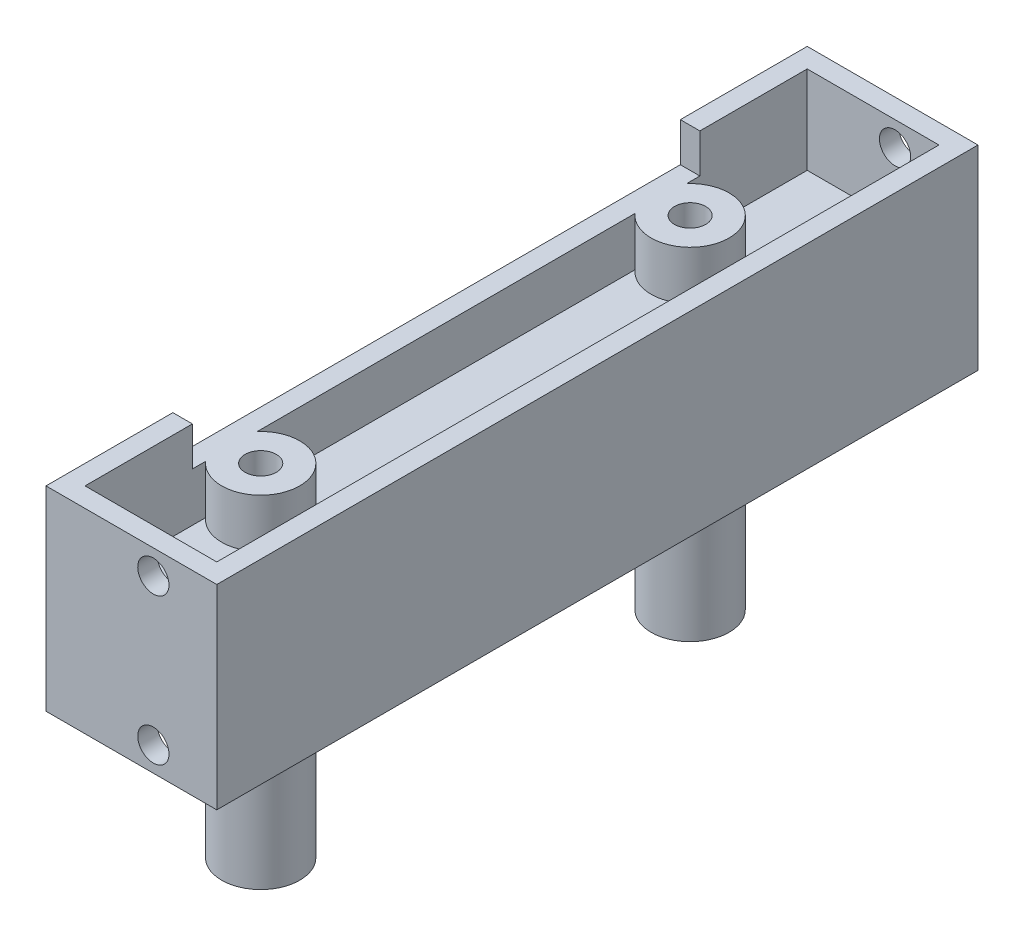
ISO-10303-21;
HEADER;
FILE_DESCRIPTION(('STEP AP214'),'2;1');
FILE_NAME('part.step','',(''),(''),'','','');
FILE_SCHEMA(('AUTOMOTIVE_DESIGN { 1 0 10303 214 1 1 1 1 }'));
ENDSEC;
DATA;
#1=APPLICATION_CONTEXT('core data for automotive mechanical design processes');
#2=APPLICATION_PROTOCOL_DEFINITION('international standard','automotive_design',2000,#1);
#3=PRODUCT_CONTEXT('',#1,'mechanical');
#4=PRODUCT('Part','Part','',(#3));
#5=PRODUCT_RELATED_PRODUCT_CATEGORY('part','',(#4));
#6=PRODUCT_DEFINITION_FORMATION('','',#4);
#7=PRODUCT_DEFINITION_CONTEXT('part definition',#1,'design');
#8=PRODUCT_DEFINITION('design','',#6,#7);
#9=PRODUCT_DEFINITION_SHAPE('','',#8);
#10=(LENGTH_UNIT() NAMED_UNIT(*) SI_UNIT(.MILLI.,.METRE.));
#11=(NAMED_UNIT(*) PLANE_ANGLE_UNIT() SI_UNIT($,.RADIAN.));
#12=(NAMED_UNIT(*) SI_UNIT($,.STERADIAN.) SOLID_ANGLE_UNIT());
#13=UNCERTAINTY_MEASURE_WITH_UNIT(LENGTH_MEASURE(1.E-05),#10,'distance_accuracy_value','');
#14=(GEOMETRIC_REPRESENTATION_CONTEXT(3) GLOBAL_UNCERTAINTY_ASSIGNED_CONTEXT((#13)) GLOBAL_UNIT_ASSIGNED_CONTEXT((#10,
#11,#12)) REPRESENTATION_CONTEXT('',''));
#15=CARTESIAN_POINT('',(0.,0.,0.));
#16=DIRECTION('',(0.,0.,1.));
#17=DIRECTION('',(1.,0.,0.));
#18=AXIS2_PLACEMENT_3D('',#15,#16,#17);
#19=CARTESIAN_POINT('',(-30.,11.,-37.));
#20=DIRECTION('',(0.,-1.,0.));
#21=DIRECTION('',(0.,0.,-1.));
#22=AXIS2_PLACEMENT_3D('',#19,#20,#21);
#23=PLANE('',#22);
#24=DIRECTION('',(-1.,0.,0.));
#25=VECTOR('',#24,1.);
#26=CARTESIAN_POINT('',(10.0573726740956,11.,-26.));
#27=LINE('',#26,#25);
#28=CARTESIAN_POINT('',(16.5,11.,-26.));
#29=VERTEX_POINT('',#28);
#30=CARTESIAN_POINT('',(14.5,11.,-26.));
#31=VERTEX_POINT('',#30);
#32=EDGE_CURVE('E450',#29,#31,#27,.T.);
#33=ORIENTED_EDGE('',*,*,#32,.F.);
#34=DIRECTION('',(0.,0.,-1.));
#35=VECTOR('',#34,1.);
#36=CARTESIAN_POINT('',(16.5,11.,-37.));
#37=LINE('',#36,#35);
#38=CARTESIAN_POINT('',(16.5,11.,-37.));
#39=VERTEX_POINT('',#38);
#40=EDGE_CURVE('E415',#29,#39,#37,.T.);
#41=ORIENTED_EDGE('',*,*,#40,.T.);
#42=DIRECTION('',(-1.,0.,0.));
#43=VECTOR('',#42,1.);
#44=CARTESIAN_POINT('',(-30.,11.,-37.));
#45=LINE('',#44,#43);
#46=CARTESIAN_POINT('',(30.,11.,-37.));
#47=VERTEX_POINT('',#46);
#48=EDGE_CURVE('E315',#47,#39,#45,.T.);
#49=ORIENTED_EDGE('',*,*,#48,.F.);
#50=DIRECTION('',(0.,0.,1.));
#51=VECTOR('',#50,1.);
#52=CARTESIAN_POINT('',(30.,11.,39.));
#53=LINE('',#52,#51);
#54=CARTESIAN_POINT('',(30.,11.,37.));
#55=VERTEX_POINT('',#54);
#56=EDGE_CURVE('E421',#47,#55,#53,.T.);
#57=ORIENTED_EDGE('',*,*,#56,.T.);
#58=DIRECTION('',(-1.,0.,0.));
#59=VECTOR('',#58,1.);
#60=CARTESIAN_POINT('',(-30.,11.,37.));
#61=LINE('',#60,#59);
#62=CARTESIAN_POINT('',(16.5,11.,37.));
#63=VERTEX_POINT('',#62);
#64=EDGE_CURVE('E302',#55,#63,#61,.T.);
#65=ORIENTED_EDGE('',*,*,#64,.T.);
#66=CARTESIAN_POINT('',(16.5,11.,26.));
#67=VERTEX_POINT('',#66);
#68=EDGE_CURVE('E391',#63,#67,#37,.T.);
#69=ORIENTED_EDGE('',*,*,#68,.T.);
#70=DIRECTION('',(1.,0.,0.));
#71=VECTOR('',#70,1.);
#72=CARTESIAN_POINT('',(10.0573726740956,11.,26.));
#73=LINE('',#72,#71);
#74=CARTESIAN_POINT('',(14.5,11.,26.));
#75=VERTEX_POINT('',#74);
#76=EDGE_CURVE('E219',#75,#67,#73,.T.);
#77=ORIENTED_EDGE('',*,*,#76,.F.);
#78=DIRECTION('',(0.,0.,-1.));
#79=VECTOR('',#78,1.);
#80=CARTESIAN_POINT('',(14.5,11.,-37.));
#81=LINE('',#80,#79);
#82=CARTESIAN_POINT('',(14.5,11.,39.));
#83=VERTEX_POINT('',#82);
#84=EDGE_CURVE('E361',#83,#75,#81,.T.);
#85=ORIENTED_EDGE('',*,*,#84,.F.);
#86=DIRECTION('',(-1.,0.,0.));
#87=VECTOR('',#86,1.);
#88=CARTESIAN_POINT('',(-30.,11.,39.));
#89=LINE('',#88,#87);
#90=CARTESIAN_POINT('',(32.,11.,39.));
#91=VERTEX_POINT('',#90);
#92=EDGE_CURVE('E299',#91,#83,#89,.T.);
#93=ORIENTED_EDGE('',*,*,#92,.F.);
#94=DIRECTION('',(0.,0.,1.));
#95=VECTOR('',#94,1.);
#96=CARTESIAN_POINT('',(32.,11.,39.));
#97=LINE('',#96,#95);
#98=CARTESIAN_POINT('',(32.,11.,-39.));
#99=VERTEX_POINT('',#98);
#100=EDGE_CURVE('E406',#99,#91,#97,.T.);
#101=ORIENTED_EDGE('',*,*,#100,.F.);
#102=DIRECTION('',(-1.,0.,0.));
#103=VECTOR('',#102,1.);
#104=CARTESIAN_POINT('',(-30.,11.,-39.));
#105=LINE('',#104,#103);
#106=CARTESIAN_POINT('',(14.5,11.,-39.));
#107=VERTEX_POINT('',#106);
#108=EDGE_CURVE('E312',#99,#107,#105,.T.);
#109=ORIENTED_EDGE('',*,*,#108,.T.);
#110=EDGE_CURVE('E366',#31,#107,#81,.T.);
#111=ORIENTED_EDGE('',*,*,#110,.F.);
#112=EDGE_LOOP('',(#33,#41,#49,#57,#65,#69,#77,#85,#93,#101,#109,#111));
#113=FACE_BOUND('',#112,.T.);
#114=ADVANCED_FACE('F41',(#113),#23,.F.);
#115=CARTESIAN_POINT('',(16.5,0.,0.));
#116=DIRECTION('',(-1.,0.,0.));
#117=DIRECTION('',(0.,0.,1.));
#118=AXIS2_PLACEMENT_3D('',#115,#116,#117);
#119=PLANE('',#118);
#120=DIRECTION('',(0.,0.,-1.));
#121=VECTOR('',#120,1.);
#122=CARTESIAN_POINT('',(16.5,7.,0.));
#123=LINE('',#122,#121);
#124=CARTESIAN_POINT('',(16.5,7.,19.3542486889354));
#125=VERTEX_POINT('',#124);
#126=CARTESIAN_POINT('',(16.5,7.,-19.3542486889354));
#127=VERTEX_POINT('',#126);
#128=EDGE_CURVE('E232',#125,#127,#123,.T.);
#129=ORIENTED_EDGE('',*,*,#128,.F.);
#130=DIRECTION('',(0.,-1.,0.));
#131=VECTOR('',#130,1.);
#132=CARTESIAN_POINT('',(16.5,7.,19.3542486889354));
#133=LINE('',#132,#131);
#134=CARTESIAN_POINT('',(16.5,2.,19.3542486889354));
#135=VERTEX_POINT('',#134);
#136=EDGE_CURVE('E382',#125,#135,#133,.T.);
#137=ORIENTED_EDGE('',*,*,#136,.T.);
#138=DIRECTION('',(0.,0.,1.));
#139=VECTOR('',#138,1.);
#140=CARTESIAN_POINT('',(16.5,2.,-37.));
#141=LINE('',#140,#139);
#142=CARTESIAN_POINT('',(16.5,2.,-19.3542486889354));
#143=VERTEX_POINT('',#142);
#144=EDGE_CURVE('E418',#143,#135,#141,.T.);
#145=ORIENTED_EDGE('',*,*,#144,.F.);
#146=DIRECTION('',(0.,-1.,0.));
#147=VECTOR('',#146,1.);
#148=CARTESIAN_POINT('',(16.5,7.,-19.3542486889354));
#149=LINE('',#148,#147);
#150=EDGE_CURVE('E388',#143,#127,#149,.F.);
#151=ORIENTED_EDGE('',*,*,#150,.T.);
#152=EDGE_LOOP('',(#129,#137,#145,#151));
#153=FACE_BOUND('',#152,.T.);
#154=ADVANCED_FACE('F491',(#153),#119,.F.);
#155=CARTESIAN_POINT('',(16.5,7.,26.));
#156=VERTEX_POINT('',#155);
#157=CARTESIAN_POINT('',(16.5,7.,24.6457513110646));
#158=VERTEX_POINT('',#157);
#159=EDGE_CURVE('E47',#156,#158,#123,.T.);
#160=ORIENTED_EDGE('',*,*,#159,.F.);
#161=DIRECTION('',(0.,1.,0.));
#162=VECTOR('',#161,1.);
#163=CARTESIAN_POINT('',(16.5,0.,26.));
#164=LINE('',#163,#162);
#165=EDGE_CURVE('E11',#156,#67,#164,.T.);
#166=ORIENTED_EDGE('',*,*,#165,.T.);
#167=ORIENTED_EDGE('',*,*,#68,.F.);
#168=DIRECTION('',(0.,1.,0.));
#169=VECTOR('',#168,1.);
#170=CARTESIAN_POINT('',(16.5,2.,37.));
#171=LINE('',#170,#169);
#172=CARTESIAN_POINT('',(16.5,2.,37.));
#173=VERTEX_POINT('',#172);
#174=EDGE_CURVE('E411',#173,#63,#171,.T.);
#175=ORIENTED_EDGE('',*,*,#174,.F.);
#176=CARTESIAN_POINT('',(16.5,2.,24.6457513110646));
#177=VERTEX_POINT('',#176);
#178=EDGE_CURVE('E419',#177,#173,#141,.T.);
#179=ORIENTED_EDGE('',*,*,#178,.F.);
#180=DIRECTION('',(0.,-1.,0.));
#181=VECTOR('',#180,1.);
#182=CARTESIAN_POINT('',(16.5,7.,24.6457513110646));
#183=LINE('',#182,#181);
#184=EDGE_CURVE('E231',#177,#158,#183,.F.);
#185=ORIENTED_EDGE('',*,*,#184,.T.);
#186=EDGE_LOOP('',(#160,#166,#167,#175,#179,#185));
#187=FACE_BOUND('',#186,.T.);
#188=ADVANCED_FACE('F233',(#187),#119,.F.);
#189=CARTESIAN_POINT('',(0.,0.,37.));
#190=DIRECTION('',(0.,0.,-1.));
#191=DIRECTION('',(-1.,0.,0.));
#192=AXIS2_PLACEMENT_3D('',#189,#190,#191);
#193=PLANE('',#192);
#194=CARTESIAN_POINT('',(25.5,-6.5,37.));
#195=DIRECTION('',(0.,0.,-1.));
#196=DIRECTION('',(-1.,0.,0.));
#197=AXIS2_PLACEMENT_3D('',#194,#195,#196);
#198=CIRCLE('',#197,1.6);
#199=CARTESIAN_POINT('',(23.9,-6.5,37.));
#200=VERTEX_POINT('',#199);
#201=EDGE_CURVE('E276',#200,#200,#198,.T.);
#202=ORIENTED_EDGE('',*,*,#201,.F.);
#203=EDGE_LOOP('',(#202));
#204=FACE_BOUND('',#203,.T.);
#205=DIRECTION('',(1.,0.,0.));
#206=VECTOR('',#205,1.);
#207=CARTESIAN_POINT('',(-30.,-9.,37.));
#208=LINE('',#207,#206);
#209=CARTESIAN_POINT('',(16.5,-9.,37.));
#210=VERTEX_POINT('',#209);
#211=CARTESIAN_POINT('',(30.,-9.,37.));
#212=VERTEX_POINT('',#211);
#213=EDGE_CURVE('E65',#210,#212,#208,.T.);
#214=ORIENTED_EDGE('',*,*,#213,.F.);
#215=DIRECTION('',(0.,1.,0.));
#216=VECTOR('',#215,1.);
#217=CARTESIAN_POINT('',(16.5,-9.,37.));
#218=LINE('',#217,#216);
#219=CARTESIAN_POINT('',(16.5,-2.,37.));
#220=VERTEX_POINT('',#219);
#221=EDGE_CURVE('E398',#210,#220,#218,.T.);
#222=ORIENTED_EDGE('',*,*,#221,.T.);
#223=DIRECTION('',(1.,0.,0.));
#224=VECTOR('',#223,1.);
#225=CARTESIAN_POINT('',(30.,-2.,37.));
#226=LINE('',#225,#224);
#227=CARTESIAN_POINT('',(30.,-2.,37.));
#228=VERTEX_POINT('',#227);
#229=EDGE_CURVE('E266',#220,#228,#226,.T.);
#230=ORIENTED_EDGE('',*,*,#229,.T.);
#231=DIRECTION('',(0.,1.,0.));
#232=VECTOR('',#231,1.);
#233=CARTESIAN_POINT('',(30.,-9.,37.));
#234=LINE('',#233,#232);
#235=EDGE_CURVE('E310',#212,#228,#234,.T.);
#236=ORIENTED_EDGE('',*,*,#235,.F.);
#237=EDGE_LOOP('',(#214,#222,#230,#236));
#238=FACE_BOUND('',#237,.T.);
#239=ADVANCED_FACE('F529',(#204,#238),#193,.T.);
#240=CARTESIAN_POINT('',(25.5,8.5,37.));
#241=DIRECTION('',(0.,0.,-1.));
#242=DIRECTION('',(-1.,0.,0.));
#243=AXIS2_PLACEMENT_3D('',#240,#241,#242);
#244=CIRCLE('',#243,1.6);
#245=CARTESIAN_POINT('',(23.9,8.5,37.));
#246=VERTEX_POINT('',#245);
#247=EDGE_CURVE('E282',#246,#246,#244,.T.);
#248=ORIENTED_EDGE('',*,*,#247,.F.);
#249=EDGE_LOOP('',(#248));
#250=FACE_BOUND('',#249,.T.);
#251=DIRECTION('',(1.,0.,0.));
#252=VECTOR('',#251,1.);
#253=CARTESIAN_POINT('',(0.,2.,37.));
#254=LINE('',#253,#252);
#255=CARTESIAN_POINT('',(30.,2.,37.));
#256=VERTEX_POINT('',#255);
#257=EDGE_CURVE('E293',#173,#256,#254,.T.);
#258=ORIENTED_EDGE('',*,*,#257,.F.);
#259=ORIENTED_EDGE('',*,*,#174,.T.);
#260=ORIENTED_EDGE('',*,*,#64,.F.);
#261=EDGE_CURVE('E296',#256,#55,#234,.T.);
#262=ORIENTED_EDGE('',*,*,#261,.F.);
#263=EDGE_LOOP('',(#258,#259,#260,#262));
#264=FACE_BOUND('',#263,.T.);
#265=ADVANCED_FACE('F480',(#250,#264),#193,.T.);
#266=CARTESIAN_POINT('',(0.,0.,-37.));
#267=DIRECTION('',(0.,0.,1.));
#268=DIRECTION('',(-1.,0.,0.));
#269=AXIS2_PLACEMENT_3D('',#266,#267,#268);
#270=PLANE('',#269);
#271=CARTESIAN_POINT('',(25.5,-6.5,-37.));
#272=DIRECTION('',(0.,0.,1.));
#273=DIRECTION('',(1.,0.,0.));
#274=AXIS2_PLACEMENT_3D('',#271,#272,#273);
#275=CIRCLE('',#274,1.6);
#276=CARTESIAN_POINT('',(27.1,-6.5,-37.));
#277=VERTEX_POINT('',#276);
#278=EDGE_CURVE('E279',#277,#277,#275,.T.);
#279=ORIENTED_EDGE('',*,*,#278,.F.);
#280=EDGE_LOOP('',(#279));
#281=FACE_BOUND('',#280,.T.);
#282=DIRECTION('',(-1.,0.,0.));
#283=VECTOR('',#282,1.);
#284=CARTESIAN_POINT('',(-30.,-2.,-37.));
#285=LINE('',#284,#283);
#286=CARTESIAN_POINT('',(30.,-2.,-37.));
#287=VERTEX_POINT('',#286);
#288=CARTESIAN_POINT('',(16.5,-2.,-37.));
#289=VERTEX_POINT('',#288);
#290=EDGE_CURVE('E260',#287,#289,#285,.T.);
#291=ORIENTED_EDGE('',*,*,#290,.T.);
#292=DIRECTION('',(0.,-1.,0.));
#293=VECTOR('',#292,1.);
#294=CARTESIAN_POINT('',(16.5,-2.,-37.));
#295=LINE('',#294,#293);
#296=CARTESIAN_POINT('',(16.5,-9.,-37.));
#297=VERTEX_POINT('',#296);
#298=EDGE_CURVE('E57',#289,#297,#295,.T.);
#299=ORIENTED_EDGE('',*,*,#298,.T.);
#300=DIRECTION('',(1.,0.,0.));
#301=VECTOR('',#300,1.);
#302=CARTESIAN_POINT('',(-30.,-9.,-37.));
#303=LINE('',#302,#301);
#304=CARTESIAN_POINT('',(30.,-9.,-37.));
#305=VERTEX_POINT('',#304);
#306=EDGE_CURVE('E324',#297,#305,#303,.T.);
#307=ORIENTED_EDGE('',*,*,#306,.T.);
#308=DIRECTION('',(0.,1.,0.));
#309=VECTOR('',#308,1.);
#310=CARTESIAN_POINT('',(30.,-9.,-37.));
#311=LINE('',#310,#309);
#312=EDGE_CURVE('E325',#305,#287,#311,.T.);
#313=ORIENTED_EDGE('',*,*,#312,.T.);
#314=EDGE_LOOP('',(#291,#299,#307,#313));
#315=FACE_BOUND('',#314,.T.);
#316=ADVANCED_FACE('F508',(#281,#315),#270,.T.);
#317=CARTESIAN_POINT('',(25.5,8.5,-37.));
#318=DIRECTION('',(0.,0.,1.));
#319=DIRECTION('',(1.,0.,0.));
#320=AXIS2_PLACEMENT_3D('',#317,#318,#319);
#321=CIRCLE('',#320,1.6);
#322=CARTESIAN_POINT('',(27.1,8.5,-37.));
#323=VERTEX_POINT('',#322);
#324=EDGE_CURVE('E285',#323,#323,#321,.T.);
#325=ORIENTED_EDGE('',*,*,#324,.F.);
#326=EDGE_LOOP('',(#325));
#327=FACE_BOUND('',#326,.T.);
#328=ORIENTED_EDGE('',*,*,#48,.T.);
#329=DIRECTION('',(0.,-1.,0.));
#330=VECTOR('',#329,1.);
#331=CARTESIAN_POINT('',(16.5,11.,-37.));
#332=LINE('',#331,#330);
#333=CARTESIAN_POINT('',(16.5,2.,-37.));
#334=VERTEX_POINT('',#333);
#335=EDGE_CURVE('E396',#39,#334,#332,.T.);
#336=ORIENTED_EDGE('',*,*,#335,.T.);
#337=DIRECTION('',(-1.,0.,0.));
#338=VECTOR('',#337,1.);
#339=CARTESIAN_POINT('',(0.,2.,-37.));
#340=LINE('',#339,#338);
#341=CARTESIAN_POINT('',(30.,2.,-37.));
#342=VERTEX_POINT('',#341);
#343=EDGE_CURVE('E305',#342,#334,#340,.T.);
#344=ORIENTED_EDGE('',*,*,#343,.F.);
#345=EDGE_CURVE('E317',#342,#47,#311,.T.);
#346=ORIENTED_EDGE('',*,*,#345,.T.);
#347=EDGE_LOOP('',(#328,#336,#344,#346));
#348=FACE_BOUND('',#347,.T.);
#349=ADVANCED_FACE('F506',(#327,#348),#270,.T.);
#350=CARTESIAN_POINT('',(0.,0.,0.));
#351=DIRECTION('',(0.,-1.,0.));
#352=DIRECTION('',(0.,0.,-1.));
#353=AXIS2_PLACEMENT_3D('',#350,#351,#352);
#354=PLANE('',#353);
#355=DIRECTION('',(1.,0.,0.));
#356=VECTOR('',#355,1.);
#357=CARTESIAN_POINT('',(-30.,0.,35.));
#358=LINE('',#357,#356);
#359=CARTESIAN_POINT('',(30.,0.,35.));
#360=VERTEX_POINT('',#359);
#361=CARTESIAN_POINT('',(16.5,0.,35.));
#362=VERTEX_POINT('',#361);
#363=EDGE_CURVE('E263',#360,#362,#358,.F.);
#364=ORIENTED_EDGE('',*,*,#363,.T.);
#365=DIRECTION('',(0.,0.,-1.));
#366=VECTOR('',#365,1.);
#367=CARTESIAN_POINT('',(16.5,0.,35.));
#368=LINE('',#367,#366);
#369=CARTESIAN_POINT('',(16.5,0.,24.6457513110646));
#370=VERTEX_POINT('',#369);
#371=EDGE_CURVE('E401',#362,#370,#368,.T.);
#372=ORIENTED_EDGE('',*,*,#371,.T.);
#373=CARTESIAN_POINT('',(19.5,0.,22.));
#374=DIRECTION('',(0.,-1.,0.));
#375=DIRECTION('',(0.,0.,-1.));
#376=AXIS2_PLACEMENT_3D('',#373,#374,#375);
#377=CIRCLE('',#376,4.);
#378=CARTESIAN_POINT('',(16.5,0.,19.3542486889354));
#379=VERTEX_POINT('',#378);
#380=EDGE_CURVE('E271',#370,#379,#377,.F.);
#381=ORIENTED_EDGE('',*,*,#380,.T.);
#382=CARTESIAN_POINT('',(16.5,0.,-19.3542486889354));
#383=VERTEX_POINT('',#382);
#384=EDGE_CURVE('E403',#379,#383,#368,.T.);
#385=ORIENTED_EDGE('',*,*,#384,.T.);
#386=CARTESIAN_POINT('',(19.5,0.,-22.));
#387=DIRECTION('',(0.,-1.,0.));
#388=DIRECTION('',(0.,0.,-1.));
#389=AXIS2_PLACEMENT_3D('',#386,#387,#388);
#390=CIRCLE('',#389,4.);
#391=CARTESIAN_POINT('',(16.5,0.,-24.6457513110646));
#392=VERTEX_POINT('',#391);
#393=EDGE_CURVE('E268',#383,#392,#390,.F.);
#394=ORIENTED_EDGE('',*,*,#393,.T.);
#395=CARTESIAN_POINT('',(16.5,0.,-35.));
#396=VERTEX_POINT('',#395);
#397=EDGE_CURVE('E408',#392,#396,#368,.T.);
#398=ORIENTED_EDGE('',*,*,#397,.T.);
#399=DIRECTION('',(-1.,0.,0.));
#400=VECTOR('',#399,1.);
#401=CARTESIAN_POINT('',(30.,0.,-35.));
#402=LINE('',#401,#400);
#403=CARTESIAN_POINT('',(30.,0.,-35.));
#404=VERTEX_POINT('',#403);
#405=EDGE_CURVE('E264',#396,#404,#402,.F.);
#406=ORIENTED_EDGE('',*,*,#405,.T.);
#407=DIRECTION('',(0.,0.,-1.));
#408=VECTOR('',#407,1.);
#409=CARTESIAN_POINT('',(30.,0.,39.));
#410=LINE('',#409,#408);
#411=EDGE_CURVE('E290',#360,#404,#410,.T.);
#412=ORIENTED_EDGE('',*,*,#411,.F.);
#413=EDGE_LOOP('',(#364,#372,#381,#385,#394,#398,#406,#412));
#414=FACE_BOUND('',#413,.T.);
#415=ADVANCED_FACE('F507',(#414),#354,.T.);
#416=CARTESIAN_POINT('',(19.5,7.,22.));
#417=DIRECTION('',(0.,-1.,0.));
#418=DIRECTION('',(0.,0.,-1.));
#419=AXIS2_PLACEMENT_3D('',#416,#417,#418);
#420=CYLINDRICAL_SURFACE('',#419,4.);
#421=CARTESIAN_POINT('',(19.5,-28.,22.));
#422=DIRECTION('',(0.,1.,0.));
#423=DIRECTION('',(0.,0.,1.));
#424=AXIS2_PLACEMENT_3D('',#421,#422,#423);
#425=CIRCLE('',#424,4.);
#426=CARTESIAN_POINT('',(19.5,-28.,26.));
#427=VERTEX_POINT('',#426);
#428=EDGE_CURVE('E354',#427,#427,#425,.T.);
#429=ORIENTED_EDGE('',*,*,#428,.T.);
#430=EDGE_LOOP('',(#429));
#431=FACE_BOUND('',#430,.T.);
#432=DIRECTION('',(0.,-1.,0.));
#433=VECTOR('',#432,1.);
#434=CARTESIAN_POINT('',(16.5,7.,19.3542486889354));
#435=LINE('',#434,#433);
#436=CARTESIAN_POINT('',(16.5,-9.,19.3542486889354));
#437=VERTEX_POINT('',#436);
#438=EDGE_CURVE('E374',#379,#437,#435,.T.);
#439=ORIENTED_EDGE('',*,*,#438,.F.);
#440=ORIENTED_EDGE('',*,*,#380,.F.);
#441=DIRECTION('',(0.,-1.,0.));
#442=VECTOR('',#441,1.);
#443=CARTESIAN_POINT('',(16.5,7.,24.6457513110646));
#444=LINE('',#443,#442);
#445=CARTESIAN_POINT('',(16.5,-9.,24.6457513110646));
#446=VERTEX_POINT('',#445);
#447=EDGE_CURVE('E377',#446,#370,#444,.F.);
#448=ORIENTED_EDGE('',*,*,#447,.F.);
#449=CARTESIAN_POINT('',(19.5,-9.,22.));
#450=DIRECTION('',(0.,-1.,0.));
#451=DIRECTION('',(0.,0.,-1.));
#452=AXIS2_PLACEMENT_3D('',#449,#450,#451);
#453=CIRCLE('',#452,4.);
#454=EDGE_CURVE('E390',#446,#437,#453,.T.);
#455=ORIENTED_EDGE('',*,*,#454,.T.);
#456=EDGE_LOOP('',(#439,#440,#448,#455));
#457=FACE_BOUND('',#456,.T.);
#458=ADVANCED_FACE('F518',(#431,#457),#420,.T.);
#459=CARTESIAN_POINT('',(19.5,7.,-22.));
#460=DIRECTION('',(0.,-1.,0.));
#461=DIRECTION('',(0.,0.,-1.));
#462=AXIS2_PLACEMENT_3D('',#459,#460,#461);
#463=CYLINDRICAL_SURFACE('',#462,4.);
#464=CARTESIAN_POINT('',(19.5,-28.,-22.));
#465=DIRECTION('',(0.,1.,0.));
#466=DIRECTION('',(0.,0.,1.));
#467=AXIS2_PLACEMENT_3D('',#464,#465,#466);
#468=CIRCLE('',#467,4.);
#469=CARTESIAN_POINT('',(19.5,-28.,-18.));
#470=VERTEX_POINT('',#469);
#471=EDGE_CURVE('E345',#470,#470,#468,.T.);
#472=ORIENTED_EDGE('',*,*,#471,.T.);
#473=EDGE_LOOP('',(#472));
#474=FACE_BOUND('',#473,.T.);
#475=DIRECTION('',(0.,-1.,0.));
#476=VECTOR('',#475,1.);
#477=CARTESIAN_POINT('',(16.5,7.,-24.6457513110646));
#478=LINE('',#477,#476);
#479=CARTESIAN_POINT('',(16.5,-9.,-24.6457513110646));
#480=VERTEX_POINT('',#479);
#481=EDGE_CURVE('E239',#392,#480,#478,.T.);
#482=ORIENTED_EDGE('',*,*,#481,.F.);
#483=ORIENTED_EDGE('',*,*,#393,.F.);
#484=DIRECTION('',(0.,-1.,0.));
#485=VECTOR('',#484,1.);
#486=CARTESIAN_POINT('',(16.5,7.,-19.3542486889354));
#487=LINE('',#486,#485);
#488=CARTESIAN_POINT('',(16.5,-9.,-19.3542486889354));
#489=VERTEX_POINT('',#488);
#490=EDGE_CURVE('E244',#489,#383,#487,.F.);
#491=ORIENTED_EDGE('',*,*,#490,.F.);
#492=CARTESIAN_POINT('',(19.5,-9.,-22.));
#493=DIRECTION('',(0.,-1.,0.));
#494=DIRECTION('',(0.,0.,-1.));
#495=AXIS2_PLACEMENT_3D('',#492,#493,#494);
#496=CIRCLE('',#495,4.);
#497=EDGE_CURVE('E393',#489,#480,#496,.T.);
#498=ORIENTED_EDGE('',*,*,#497,.T.);
#499=EDGE_LOOP('',(#482,#483,#491,#498));
#500=FACE_BOUND('',#499,.T.);
#501=ADVANCED_FACE('F589',(#474,#500),#463,.T.);
#502=ORIENTED_EDGE('',*,*,#136,.F.);
#503=CARTESIAN_POINT('',(19.5,7.,22.));
#504=DIRECTION('',(0.,1.,0.));
#505=DIRECTION('',(0.,0.,1.));
#506=AXIS2_PLACEMENT_3D('',#503,#504,#505);
#507=CIRCLE('',#506,4.);
#508=EDGE_CURVE('E363',#158,#125,#507,.T.);
#509=ORIENTED_EDGE('',*,*,#508,.F.);
#510=ORIENTED_EDGE('',*,*,#184,.F.);
#511=CARTESIAN_POINT('',(19.5,2.,22.));
#512=DIRECTION('',(0.,-1.,0.));
#513=DIRECTION('',(0.,0.,-1.));
#514=AXIS2_PLACEMENT_3D('',#511,#512,#513);
#515=CIRCLE('',#514,4.);
#516=EDGE_CURVE('E295',#177,#135,#515,.F.);
#517=ORIENTED_EDGE('',*,*,#516,.T.);
#518=EDGE_LOOP('',(#502,#509,#510,#517));
#519=FACE_BOUND('',#518,.T.);
#520=ADVANCED_FACE('F493',(#519),#420,.T.);
#521=DIRECTION('',(0.,-1.,0.));
#522=VECTOR('',#521,1.);
#523=CARTESIAN_POINT('',(16.5,7.,-24.6457513110646));
#524=LINE('',#523,#522);
#525=CARTESIAN_POINT('',(16.5,7.,-24.6457513110646));
#526=VERTEX_POINT('',#525);
#527=CARTESIAN_POINT('',(16.5,2.,-24.6457513110646));
#528=VERTEX_POINT('',#527);
#529=EDGE_CURVE('E381',#526,#528,#524,.T.);
#530=ORIENTED_EDGE('',*,*,#529,.F.);
#531=CARTESIAN_POINT('',(19.5,7.,-22.));
#532=DIRECTION('',(0.,1.,0.));
#533=DIRECTION('',(0.,0.,1.));
#534=AXIS2_PLACEMENT_3D('',#531,#532,#533);
#535=CIRCLE('',#534,4.);
#536=EDGE_CURVE('E347',#127,#526,#535,.T.);
#537=ORIENTED_EDGE('',*,*,#536,.F.);
#538=ORIENTED_EDGE('',*,*,#150,.F.);
#539=CARTESIAN_POINT('',(19.5,2.,-22.));
#540=DIRECTION('',(0.,-1.,0.));
#541=DIRECTION('',(0.,0.,-1.));
#542=AXIS2_PLACEMENT_3D('',#539,#540,#541);
#543=CIRCLE('',#542,4.);
#544=EDGE_CURVE('E267',#143,#528,#543,.F.);
#545=ORIENTED_EDGE('',*,*,#544,.T.);
#546=EDGE_LOOP('',(#530,#537,#538,#545));
#547=FACE_BOUND('',#546,.T.);
#548=ADVANCED_FACE('F500',(#547),#463,.T.);
#549=CARTESIAN_POINT('',(19.5,7.,-22.));
#550=DIRECTION('',(0.,1.,0.));
#551=DIRECTION('',(0.,0.,1.));
#552=AXIS2_PLACEMENT_3D('',#549,#550,#551);
#553=PLANE('',#552);
#554=CARTESIAN_POINT('',(19.5,7.,22.));
#555=DIRECTION('',(0.,1.,0.));
#556=DIRECTION('',(0.,0.,1.));
#557=AXIS2_PLACEMENT_3D('',#554,#555,#556);
#558=CIRCLE('',#557,1.6);
#559=CARTESIAN_POINT('',(19.5,7.,23.6));
#560=VERTEX_POINT('',#559);
#561=EDGE_CURVE('E356',#560,#560,#558,.T.);
#562=ORIENTED_EDGE('',*,*,#561,.F.);
#563=EDGE_LOOP('',(#562));
#564=FACE_BOUND('',#563,.T.);
#565=CARTESIAN_POINT('',(19.5,7.,-22.));
#566=DIRECTION('',(0.,1.,0.));
#567=DIRECTION('',(0.,0.,1.));
#568=AXIS2_PLACEMENT_3D('',#565,#566,#567);
#569=CIRCLE('',#568,1.6);
#570=CARTESIAN_POINT('',(19.5,7.,-20.4));
#571=VERTEX_POINT('',#570);
#572=EDGE_CURVE('E350',#571,#571,#569,.T.);
#573=ORIENTED_EDGE('',*,*,#572,.F.);
#574=EDGE_LOOP('',(#573));
#575=FACE_BOUND('',#574,.T.);
#576=ORIENTED_EDGE('',*,*,#536,.T.);
#577=CARTESIAN_POINT('',(16.5,7.,-26.));
#578=VERTEX_POINT('',#577);
#579=EDGE_CURVE('E240',#526,#578,#123,.T.);
#580=ORIENTED_EDGE('',*,*,#579,.T.);
#581=DIRECTION('',(1.,0.,0.));
#582=VECTOR('',#581,1.);
#583=CARTESIAN_POINT('',(10.0573726740956,7.,-26.));
#584=LINE('',#583,#582);
#585=CARTESIAN_POINT('',(14.5,7.,-26.));
#586=VERTEX_POINT('',#585);
#587=EDGE_CURVE('E230',#586,#578,#584,.T.);
#588=ORIENTED_EDGE('',*,*,#587,.F.);
#589=DIRECTION('',(0.,0.,-1.));
#590=VECTOR('',#589,1.);
#591=CARTESIAN_POINT('',(14.5,7.00000000000001,39.));
#592=LINE('',#591,#590);
#593=CARTESIAN_POINT('',(14.5,7.,26.));
#594=VERTEX_POINT('',#593);
#595=EDGE_CURVE('E226',#594,#586,#592,.T.);
#596=ORIENTED_EDGE('',*,*,#595,.F.);
#597=DIRECTION('',(-1.,0.,0.));
#598=VECTOR('',#597,1.);
#599=CARTESIAN_POINT('',(10.0573726740956,7.,26.));
#600=LINE('',#599,#598);
#601=EDGE_CURVE('E218',#156,#594,#600,.T.);
#602=ORIENTED_EDGE('',*,*,#601,.F.);
#603=ORIENTED_EDGE('',*,*,#159,.T.);
#604=ORIENTED_EDGE('',*,*,#508,.T.);
#605=ORIENTED_EDGE('',*,*,#128,.T.);
#606=EDGE_LOOP('',(#576,#580,#588,#596,#602,#603,#604,#605));
#607=FACE_BOUND('',#606,.T.);
#608=ADVANCED_FACE('F223',(#564,#575,#607),#553,.T.);
#609=CARTESIAN_POINT('',(-30.,2.,39.));
#610=DIRECTION('',(0.,0.,-1.));
#611=DIRECTION('',(-1.,0.,0.));
#612=AXIS2_PLACEMENT_3D('',#609,#610,#611);
#613=PLANE('',#612);
#614=CARTESIAN_POINT('',(25.5,-6.5,39.));
#615=DIRECTION('',(0.,0.,1.));
#616=DIRECTION('',(1.,0.,0.));
#617=AXIS2_PLACEMENT_3D('',#614,#615,#616);
#618=CIRCLE('',#617,1.6);
#619=CARTESIAN_POINT('',(27.1,-6.5,39.));
#620=VERTEX_POINT('',#619);
#621=EDGE_CURVE('E286',#620,#620,#618,.T.);
#622=ORIENTED_EDGE('',*,*,#621,.F.);
#623=EDGE_LOOP('',(#622));
#624=FACE_BOUND('',#623,.T.);
#625=CARTESIAN_POINT('',(25.5,8.5,39.));
#626=DIRECTION('',(0.,0.,1.));
#627=DIRECTION('',(-1.,0.,0.));
#628=AXIS2_PLACEMENT_3D('',#625,#626,#627);
#629=CIRCLE('',#628,1.6);
#630=CARTESIAN_POINT('',(23.9,8.5,39.));
#631=VERTEX_POINT('',#630);
#632=EDGE_CURVE('E275',#631,#631,#629,.T.);
#633=ORIENTED_EDGE('',*,*,#632,.F.);
#634=EDGE_LOOP('',(#633));
#635=FACE_BOUND('',#634,.T.);
#636=DIRECTION('',(0.,1.,0.));
#637=VECTOR('',#636,1.);
#638=CARTESIAN_POINT('',(14.5,-73.,39.));
#639=LINE('',#638,#637);
#640=CARTESIAN_POINT('',(14.5,-8.99999999999999,39.));
#641=VERTEX_POINT('',#640);
#642=EDGE_CURVE('E375',#641,#83,#639,.T.);
#643=ORIENTED_EDGE('',*,*,#642,.F.);
#644=DIRECTION('',(1.,0.,0.));
#645=VECTOR('',#644,1.);
#646=CARTESIAN_POINT('',(-30.,-9.,39.));
#647=LINE('',#646,#645);
#648=CARTESIAN_POINT('',(32.,-9.,39.));
#649=VERTEX_POINT('',#648);
#650=EDGE_CURVE('E298',#641,#649,#647,.T.);
#651=ORIENTED_EDGE('',*,*,#650,.T.);
#652=DIRECTION('',(0.,-1.,0.));
#653=VECTOR('',#652,1.);
#654=CARTESIAN_POINT('',(32.,11.,39.));
#655=LINE('',#654,#653);
#656=EDGE_CURVE('E428',#91,#649,#655,.T.);
#657=ORIENTED_EDGE('',*,*,#656,.F.);
#658=ORIENTED_EDGE('',*,*,#92,.T.);
#659=EDGE_LOOP('',(#643,#651,#657,#658));
#660=FACE_BOUND('',#659,.T.);
#661=ADVANCED_FACE('F472',(#624,#635,#660),#613,.F.);
#662=CARTESIAN_POINT('',(0.,2.,0.));
#663=DIRECTION('',(0.,-1.,0.));
#664=DIRECTION('',(0.,0.,-1.));
#665=AXIS2_PLACEMENT_3D('',#662,#663,#664);
#666=PLANE('',#665);
#667=ORIENTED_EDGE('',*,*,#343,.T.);
#668=EDGE_CURVE('E416',#334,#528,#141,.T.);
#669=ORIENTED_EDGE('',*,*,#668,.T.);
#670=ORIENTED_EDGE('',*,*,#544,.F.);
#671=ORIENTED_EDGE('',*,*,#144,.T.);
#672=ORIENTED_EDGE('',*,*,#516,.F.);
#673=ORIENTED_EDGE('',*,*,#178,.T.);
#674=ORIENTED_EDGE('',*,*,#257,.T.);
#675=DIRECTION('',(0.,0.,-1.));
#676=VECTOR('',#675,1.);
#677=CARTESIAN_POINT('',(30.,2.,39.));
#678=LINE('',#677,#676);
#679=EDGE_CURVE('E289',#256,#342,#678,.T.);
#680=ORIENTED_EDGE('',*,*,#679,.T.);
#681=EDGE_LOOP('',(#667,#669,#670,#671,#672,#673,#674,#680));
#682=FACE_BOUND('',#681,.T.);
#683=ADVANCED_FACE('F485',(#682),#666,.F.);
#684=CARTESIAN_POINT('',(-30.,-9.,37.));
#685=DIRECTION('',(0.,-1.,0.));
#686=DIRECTION('',(0.,0.,-1.));
#687=AXIS2_PLACEMENT_3D('',#684,#685,#686);
#688=PLANE('',#687);
#689=DIRECTION('',(1.,0.,0.));
#690=VECTOR('',#689,1.);
#691=CARTESIAN_POINT('',(-30.,-9.,-39.));
#692=LINE('',#691,#690);
#693=CARTESIAN_POINT('',(14.5,-8.99999999999999,-39.));
#694=VERTEX_POINT('',#693);
#695=CARTESIAN_POINT('',(32.,-9.,-39.));
#696=VERTEX_POINT('',#695);
#697=EDGE_CURVE('E320',#694,#696,#692,.T.);
#698=ORIENTED_EDGE('',*,*,#697,.T.);
#699=DIRECTION('',(0.,0.,-1.));
#700=VECTOR('',#699,1.);
#701=CARTESIAN_POINT('',(32.,-9.,39.));
#702=LINE('',#701,#700);
#703=EDGE_CURVE('E436',#649,#696,#702,.T.);
#704=ORIENTED_EDGE('',*,*,#703,.F.);
#705=ORIENTED_EDGE('',*,*,#650,.F.);
#706=DIRECTION('',(0.,0.,1.));
#707=VECTOR('',#706,1.);
#708=CARTESIAN_POINT('',(14.5,-9.,-37.));
#709=LINE('',#708,#707);
#710=EDGE_CURVE('E370',#694,#641,#709,.T.);
#711=ORIENTED_EDGE('',*,*,#710,.F.);
#712=EDGE_LOOP('',(#698,#704,#705,#711));
#713=FACE_BOUND('',#712,.T.);
#714=DIRECTION('',(0.,0.,-1.));
#715=VECTOR('',#714,1.);
#716=CARTESIAN_POINT('',(30.,-9.,39.));
#717=LINE('',#716,#715);
#718=EDGE_CURVE('E430',#212,#305,#717,.T.);
#719=ORIENTED_EDGE('',*,*,#718,.T.);
#720=ORIENTED_EDGE('',*,*,#306,.F.);
#721=DIRECTION('',(0.,0.,1.));
#722=VECTOR('',#721,1.);
#723=CARTESIAN_POINT('',(16.5,-9.,-37.));
#724=LINE('',#723,#722);
#725=EDGE_CURVE('E394',#297,#480,#724,.T.);
#726=ORIENTED_EDGE('',*,*,#725,.T.);
#727=ORIENTED_EDGE('',*,*,#497,.F.);
#728=EDGE_CURVE('E400',#489,#437,#724,.T.);
#729=ORIENTED_EDGE('',*,*,#728,.T.);
#730=ORIENTED_EDGE('',*,*,#454,.F.);
#731=EDGE_CURVE('E397',#446,#210,#724,.T.);
#732=ORIENTED_EDGE('',*,*,#731,.T.);
#733=ORIENTED_EDGE('',*,*,#213,.T.);
#734=EDGE_LOOP('',(#719,#720,#726,#727,#729,#730,#732,#733));
#735=FACE_BOUND('',#734,.T.);
#736=ADVANCED_FACE('F466',(#713,#735),#688,.T.);
#737=CARTESIAN_POINT('',(0.,-2.,35.));
#738=DIRECTION('',(-1.,0.,0.));
#739=DIRECTION('',(0.,0.,1.));
#740=AXIS2_PLACEMENT_3D('',#737,#738,#739);
#741=CYLINDRICAL_SURFACE('',#740,2.);
#742=ORIENTED_EDGE('',*,*,#229,.F.);
#743=CARTESIAN_POINT('',(16.5,-2.,35.));
#744=DIRECTION('',(-1.,0.,0.));
#745=DIRECTION('',(0.,0.,1.));
#746=AXIS2_PLACEMENT_3D('',#743,#744,#745);
#747=CIRCLE('',#746,2.);
#748=EDGE_CURVE('E402',#220,#362,#747,.T.);
#749=ORIENTED_EDGE('',*,*,#748,.T.);
#750=ORIENTED_EDGE('',*,*,#363,.F.);
#751=CARTESIAN_POINT('',(30.,-2.,35.));
#752=DIRECTION('',(-1.,0.,0.));
#753=DIRECTION('',(0.,0.,1.));
#754=AXIS2_PLACEMENT_3D('',#751,#752,#753);
#755=CIRCLE('',#754,2.);
#756=EDGE_CURVE('E258',#228,#360,#755,.T.);
#757=ORIENTED_EDGE('',*,*,#756,.F.);
#758=EDGE_LOOP('',(#742,#749,#750,#757));
#759=FACE_BOUND('',#758,.T.);
#760=ADVANCED_FACE('F538',(#759),#741,.F.);
#761=CARTESIAN_POINT('',(0.,-2.,-35.));
#762=DIRECTION('',(1.,0.,0.));
#763=DIRECTION('',(0.,0.,-1.));
#764=AXIS2_PLACEMENT_3D('',#761,#762,#763);
#765=CYLINDRICAL_SURFACE('',#764,2.);
#766=ORIENTED_EDGE('',*,*,#405,.F.);
#767=CARTESIAN_POINT('',(16.5,-2.,-35.));
#768=DIRECTION('',(-1.,0.,0.));
#769=DIRECTION('',(0.,0.,1.));
#770=AXIS2_PLACEMENT_3D('',#767,#768,#769);
#771=CIRCLE('',#770,2.);
#772=EDGE_CURVE('E409',#396,#289,#771,.T.);
#773=ORIENTED_EDGE('',*,*,#772,.T.);
#774=ORIENTED_EDGE('',*,*,#290,.F.);
#775=CARTESIAN_POINT('',(30.,-2.,-35.));
#776=DIRECTION('',(-1.,0.,0.));
#777=DIRECTION('',(0.,0.,1.));
#778=AXIS2_PLACEMENT_3D('',#775,#776,#777);
#779=CIRCLE('',#778,2.);
#780=EDGE_CURVE('E252',#404,#287,#779,.T.);
#781=ORIENTED_EDGE('',*,*,#780,.F.);
#782=EDGE_LOOP('',(#766,#773,#774,#781));
#783=FACE_BOUND('',#782,.T.);
#784=ADVANCED_FACE('F43',(#783),#765,.F.);
#785=CARTESIAN_POINT('',(-30.,2.,-39.));
#786=DIRECTION('',(0.,0.,1.));
#787=DIRECTION('',(1.,0.,0.));
#788=AXIS2_PLACEMENT_3D('',#785,#786,#787);
#789=PLANE('',#788);
#790=CARTESIAN_POINT('',(25.5,-6.5,-39.));
#791=DIRECTION('',(0.,0.,1.));
#792=DIRECTION('',(1.,0.,0.));
#793=AXIS2_PLACEMENT_3D('',#790,#791,#792);
#794=CIRCLE('',#793,1.6);
#795=CARTESIAN_POINT('',(27.1,-6.5,-39.));
#796=VERTEX_POINT('',#795);
#797=EDGE_CURVE('E316',#796,#796,#794,.T.);
#798=ORIENTED_EDGE('',*,*,#797,.T.);
#799=EDGE_LOOP('',(#798));
#800=FACE_BOUND('',#799,.T.);
#801=CARTESIAN_POINT('',(25.5,8.5,-39.));
#802=DIRECTION('',(0.,0.,1.));
#803=DIRECTION('',(1.,0.,0.));
#804=AXIS2_PLACEMENT_3D('',#801,#802,#803);
#805=CIRCLE('',#804,1.6);
#806=CARTESIAN_POINT('',(27.1,8.5,-39.));
#807=VERTEX_POINT('',#806);
#808=EDGE_CURVE('E283',#807,#807,#805,.T.);
#809=ORIENTED_EDGE('',*,*,#808,.T.);
#810=EDGE_LOOP('',(#809));
#811=FACE_BOUND('',#810,.T.);
#812=ORIENTED_EDGE('',*,*,#697,.F.);
#813=DIRECTION('',(0.,1.,0.));
#814=VECTOR('',#813,1.);
#815=CARTESIAN_POINT('',(14.5,-73.,-39.));
#816=LINE('',#815,#814);
#817=EDGE_CURVE('E367',#694,#107,#816,.T.);
#818=ORIENTED_EDGE('',*,*,#817,.T.);
#819=ORIENTED_EDGE('',*,*,#108,.F.);
#820=DIRECTION('',(0.,1.,0.));
#821=VECTOR('',#820,1.);
#822=CARTESIAN_POINT('',(32.,11.,-39.));
#823=LINE('',#822,#821);
#824=EDGE_CURVE('E433',#696,#99,#823,.T.);
#825=ORIENTED_EDGE('',*,*,#824,.F.);
#826=EDGE_LOOP('',(#812,#818,#819,#825));
#827=FACE_BOUND('',#826,.T.);
#828=ADVANCED_FACE('F461',(#800,#811,#827),#789,.F.);
#829=CARTESIAN_POINT('',(25.5,8.5,-87.));
#830=DIRECTION('',(0.,0.,1.));
#831=DIRECTION('',(1.,0.,0.));
#832=AXIS2_PLACEMENT_3D('',#829,#830,#831);
#833=CYLINDRICAL_SURFACE('',#832,1.6);
#834=ORIENTED_EDGE('',*,*,#324,.T.);
#835=EDGE_LOOP('',(#834));
#836=FACE_BOUND('',#835,.T.);
#837=ORIENTED_EDGE('',*,*,#808,.F.);
#838=EDGE_LOOP('',(#837));
#839=FACE_BOUND('',#838,.T.);
#840=ADVANCED_FACE('F552',(#836,#839),#833,.F.);
#841=CARTESIAN_POINT('',(25.5,-6.5,-87.));
#842=DIRECTION('',(0.,0.,1.));
#843=DIRECTION('',(1.,0.,0.));
#844=AXIS2_PLACEMENT_3D('',#841,#842,#843);
#845=CYLINDRICAL_SURFACE('',#844,1.6);
#846=ORIENTED_EDGE('',*,*,#278,.T.);
#847=EDGE_LOOP('',(#846));
#848=FACE_BOUND('',#847,.T.);
#849=ORIENTED_EDGE('',*,*,#797,.F.);
#850=EDGE_LOOP('',(#849));
#851=FACE_BOUND('',#850,.T.);
#852=ADVANCED_FACE('F618',(#848,#851),#845,.F.);
#853=ORIENTED_EDGE('',*,*,#247,.T.);
#854=EDGE_LOOP('',(#853));
#855=FACE_BOUND('',#854,.T.);
#856=ORIENTED_EDGE('',*,*,#632,.T.);
#857=EDGE_LOOP('',(#856));
#858=FACE_BOUND('',#857,.T.);
#859=ADVANCED_FACE('F616',(#855,#858),#833,.F.);
#860=ORIENTED_EDGE('',*,*,#201,.T.);
#861=EDGE_LOOP('',(#860));
#862=FACE_BOUND('',#861,.T.);
#863=ORIENTED_EDGE('',*,*,#621,.T.);
#864=EDGE_LOOP('',(#863));
#865=FACE_BOUND('',#864,.T.);
#866=ADVANCED_FACE('F619',(#862,#865),#845,.F.);
#867=CARTESIAN_POINT('',(19.5,-28.,22.));
#868=DIRECTION('',(0.,1.,0.));
#869=DIRECTION('',(0.,0.,1.));
#870=AXIS2_PLACEMENT_3D('',#867,#868,#869);
#871=PLANE('',#870);
#872=CARTESIAN_POINT('',(19.5,-28.,22.));
#873=DIRECTION('',(0.,1.,0.));
#874=DIRECTION('',(0.,0.,1.));
#875=AXIS2_PLACEMENT_3D('',#872,#873,#874);
#876=CIRCLE('',#875,1.6);
#877=CARTESIAN_POINT('',(19.5,-28.,23.6));
#878=VERTEX_POINT('',#877);
#879=EDGE_CURVE('E355',#878,#878,#876,.T.);
#880=ORIENTED_EDGE('',*,*,#879,.T.);
#881=EDGE_LOOP('',(#880));
#882=FACE_BOUND('',#881,.T.);
#883=ORIENTED_EDGE('',*,*,#428,.F.);
#884=EDGE_LOOP('',(#883));
#885=FACE_BOUND('',#884,.T.);
#886=ADVANCED_FACE('F613',(#882,#885),#871,.F.);
#887=CARTESIAN_POINT('',(19.5,-28.,-22.));
#888=DIRECTION('',(0.,1.,0.));
#889=DIRECTION('',(0.,0.,1.));
#890=AXIS2_PLACEMENT_3D('',#887,#888,#889);
#891=PLANE('',#890);
#892=CARTESIAN_POINT('',(19.5,-28.,-22.));
#893=DIRECTION('',(0.,1.,0.));
#894=DIRECTION('',(0.,0.,1.));
#895=AXIS2_PLACEMENT_3D('',#892,#893,#894);
#896=CIRCLE('',#895,1.6);
#897=CARTESIAN_POINT('',(19.5,-28.,-20.4));
#898=VERTEX_POINT('',#897);
#899=EDGE_CURVE('E278',#898,#898,#896,.T.);
#900=ORIENTED_EDGE('',*,*,#899,.T.);
#901=EDGE_LOOP('',(#900));
#902=FACE_BOUND('',#901,.T.);
#903=ORIENTED_EDGE('',*,*,#471,.F.);
#904=EDGE_LOOP('',(#903));
#905=FACE_BOUND('',#904,.T.);
#906=ADVANCED_FACE('F544',(#902,#905),#891,.F.);
#907=CARTESIAN_POINT('',(19.5,-10.,22.));
#908=DIRECTION('',(0.,1.,0.));
#909=DIRECTION('',(0.,0.,1.));
#910=AXIS2_PLACEMENT_3D('',#907,#908,#909);
#911=CYLINDRICAL_SURFACE('',#910,1.6);
#912=ORIENTED_EDGE('',*,*,#879,.F.);
#913=EDGE_LOOP('',(#912));
#914=FACE_BOUND('',#913,.T.);
#915=ORIENTED_EDGE('',*,*,#561,.T.);
#916=EDGE_LOOP('',(#915));
#917=FACE_BOUND('',#916,.T.);
#918=ADVANCED_FACE('F536',(#914,#917),#911,.F.);
#919=CARTESIAN_POINT('',(19.5,-10.,-22.));
#920=DIRECTION('',(0.,1.,0.));
#921=DIRECTION('',(0.,0.,1.));
#922=AXIS2_PLACEMENT_3D('',#919,#920,#921);
#923=CYLINDRICAL_SURFACE('',#922,1.6);
#924=ORIENTED_EDGE('',*,*,#899,.F.);
#925=EDGE_LOOP('',(#924));
#926=FACE_BOUND('',#925,.T.);
#927=ORIENTED_EDGE('',*,*,#572,.T.);
#928=EDGE_LOOP('',(#927));
#929=FACE_BOUND('',#928,.T.);
#930=ADVANCED_FACE('F539',(#926,#929),#923,.F.);
#931=CARTESIAN_POINT('',(14.5,-73.,39.));
#932=DIRECTION('',(-1.,0.,0.));
#933=DIRECTION('',(0.,0.,1.));
#934=AXIS2_PLACEMENT_3D('',#931,#932,#933);
#935=PLANE('',#934);
#936=DIRECTION('',(0.,1.,0.));
#937=VECTOR('',#936,1.);
#938=CARTESIAN_POINT('',(14.5,-73.,26.));
#939=LINE('',#938,#937);
#940=EDGE_CURVE('E427',#594,#75,#939,.T.);
#941=ORIENTED_EDGE('',*,*,#940,.F.);
#942=ORIENTED_EDGE('',*,*,#595,.T.);
#943=DIRECTION('',(0.,-1.,0.));
#944=VECTOR('',#943,1.);
#945=CARTESIAN_POINT('',(14.5,-73.,-26.));
#946=LINE('',#945,#944);
#947=EDGE_CURVE('E445',#31,#586,#946,.T.);
#948=ORIENTED_EDGE('',*,*,#947,.F.);
#949=ORIENTED_EDGE('',*,*,#110,.T.);
#950=ORIENTED_EDGE('',*,*,#817,.F.);
#951=ORIENTED_EDGE('',*,*,#710,.T.);
#952=ORIENTED_EDGE('',*,*,#642,.T.);
#953=ORIENTED_EDGE('',*,*,#84,.T.);
#954=EDGE_LOOP('',(#941,#942,#948,#949,#950,#951,#952,#953));
#955=FACE_BOUND('',#954,.T.);
#956=ADVANCED_FACE('F458',(#955),#935,.T.);
#957=ORIENTED_EDGE('',*,*,#40,.F.);
#958=DIRECTION('',(0.,-1.,0.));
#959=VECTOR('',#958,1.);
#960=CARTESIAN_POINT('',(16.5,0.,-26.));
#961=LINE('',#960,#959);
#962=EDGE_CURVE('E238',#29,#578,#961,.T.);
#963=ORIENTED_EDGE('',*,*,#962,.T.);
#964=ORIENTED_EDGE('',*,*,#579,.F.);
#965=ORIENTED_EDGE('',*,*,#529,.T.);
#966=ORIENTED_EDGE('',*,*,#668,.F.);
#967=ORIENTED_EDGE('',*,*,#335,.F.);
#968=EDGE_LOOP('',(#957,#963,#964,#965,#966,#967));
#969=FACE_BOUND('',#968,.T.);
#970=ADVANCED_FACE('F497',(#969),#119,.F.);
#971=CARTESIAN_POINT('',(16.5,-2.,35.));
#972=DIRECTION('',(-1.,0.,0.));
#973=DIRECTION('',(0.,0.,1.));
#974=AXIS2_PLACEMENT_3D('',#971,#972,#973);
#975=PLANE('',#974);
#976=ORIENTED_EDGE('',*,*,#384,.F.);
#977=ORIENTED_EDGE('',*,*,#438,.T.);
#978=ORIENTED_EDGE('',*,*,#728,.F.);
#979=ORIENTED_EDGE('',*,*,#490,.T.);
#980=EDGE_LOOP('',(#976,#977,#978,#979));
#981=FACE_BOUND('',#980,.T.);
#982=ADVANCED_FACE('F580',(#981),#975,.F.);
#983=ORIENTED_EDGE('',*,*,#731,.F.);
#984=ORIENTED_EDGE('',*,*,#447,.T.);
#985=ORIENTED_EDGE('',*,*,#371,.F.);
#986=ORIENTED_EDGE('',*,*,#748,.F.);
#987=ORIENTED_EDGE('',*,*,#221,.F.);
#988=EDGE_LOOP('',(#983,#984,#985,#986,#987));
#989=FACE_BOUND('',#988,.T.);
#990=ADVANCED_FACE('F568',(#989),#975,.F.);
#991=ORIENTED_EDGE('',*,*,#397,.F.);
#992=ORIENTED_EDGE('',*,*,#481,.T.);
#993=ORIENTED_EDGE('',*,*,#725,.F.);
#994=ORIENTED_EDGE('',*,*,#298,.F.);
#995=ORIENTED_EDGE('',*,*,#772,.F.);
#996=EDGE_LOOP('',(#991,#992,#993,#994,#995));
#997=FACE_BOUND('',#996,.T.);
#998=ADVANCED_FACE('F590',(#997),#975,.F.);
#999=CARTESIAN_POINT('',(30.,0.,0.));
#1000=DIRECTION('',(1.,0.,0.));
#1001=DIRECTION('',(0.,0.,-1.));
#1002=AXIS2_PLACEMENT_3D('',#999,#1000,#1001);
#1003=PLANE('',#1002);
#1004=ORIENTED_EDGE('',*,*,#718,.F.);
#1005=ORIENTED_EDGE('',*,*,#235,.T.);
#1006=ORIENTED_EDGE('',*,*,#756,.T.);
#1007=ORIENTED_EDGE('',*,*,#411,.T.);
#1008=ORIENTED_EDGE('',*,*,#780,.T.);
#1009=ORIENTED_EDGE('',*,*,#312,.F.);
#1010=EDGE_LOOP('',(#1004,#1005,#1006,#1007,#1008,#1009));
#1011=FACE_BOUND('',#1010,.T.);
#1012=ADVANCED_FACE('F584',(#1011),#1003,.F.);
#1013=CARTESIAN_POINT('',(32.,0.,0.));
#1014=DIRECTION('',(1.,0.,0.));
#1015=DIRECTION('',(0.,0.,-1.));
#1016=AXIS2_PLACEMENT_3D('',#1013,#1014,#1015);
#1017=PLANE('',#1016);
#1018=ORIENTED_EDGE('',*,*,#656,.T.);
#1019=ORIENTED_EDGE('',*,*,#703,.T.);
#1020=ORIENTED_EDGE('',*,*,#824,.T.);
#1021=ORIENTED_EDGE('',*,*,#100,.T.);
#1022=EDGE_LOOP('',(#1018,#1019,#1020,#1021));
#1023=FACE_BOUND('',#1022,.T.);
#1024=ADVANCED_FACE('F462',(#1023),#1017,.T.);
#1025=ORIENTED_EDGE('',*,*,#345,.F.);
#1026=ORIENTED_EDGE('',*,*,#679,.F.);
#1027=ORIENTED_EDGE('',*,*,#261,.T.);
#1028=ORIENTED_EDGE('',*,*,#56,.F.);
#1029=EDGE_LOOP('',(#1025,#1026,#1027,#1028));
#1030=FACE_BOUND('',#1029,.T.);
#1031=ADVANCED_FACE('F504',(#1030),#1003,.F.);
#1032=CARTESIAN_POINT('',(10.0573726740956,-45.8503851529572,26.));
#1033=DIRECTION('',(0.,0.,1.));
#1034=DIRECTION('',(1.,0.,0.));
#1035=AXIS2_PLACEMENT_3D('',#1032,#1033,#1034);
#1036=PLANE('',#1035);
#1037=ORIENTED_EDGE('',*,*,#940,.T.);
#1038=ORIENTED_EDGE('',*,*,#76,.T.);
#1039=ORIENTED_EDGE('',*,*,#165,.F.);
#1040=ORIENTED_EDGE('',*,*,#601,.T.);
#1041=EDGE_LOOP('',(#1037,#1038,#1039,#1040));
#1042=FACE_BOUND('',#1041,.T.);
#1043=ADVANCED_FACE('F211',(#1042),#1036,.F.);
#1044=CARTESIAN_POINT('',(10.0573726740956,-45.8503851529572,-26.));
#1045=DIRECTION('',(0.,0.,-1.));
#1046=DIRECTION('',(-1.,0.,0.));
#1047=AXIS2_PLACEMENT_3D('',#1044,#1045,#1046);
#1048=PLANE('',#1047);
#1049=ORIENTED_EDGE('',*,*,#947,.T.);
#1050=ORIENTED_EDGE('',*,*,#587,.T.);
#1051=ORIENTED_EDGE('',*,*,#962,.F.);
#1052=ORIENTED_EDGE('',*,*,#32,.T.);
#1053=EDGE_LOOP('',(#1049,#1050,#1051,#1052));
#1054=FACE_BOUND('',#1053,.T.);
#1055=ADVANCED_FACE('F453',(#1054),#1048,.F.);
#1056=CLOSED_SHELL('',(#114,#154,#188,#239,#265,#316,#349,#415,#458,#501,#520,#548,#608,#661,
#683,#736,#760,#784,#828,#840,#852,#859,#866,#886,#906,#918,#930,#956,#970,#982,#990,#998,#1012,
#1024,#1031,#1043,#1055));
#1057=MANIFOLD_SOLID_BREP('B2',#1056);
#1058=ADVANCED_BREP_SHAPE_REPRESENTATION('',(#18,#1057),#14);
#1059=SHAPE_DEFINITION_REPRESENTATION(#9,#1058);
ENDSEC;
END-ISO-10303-21;
